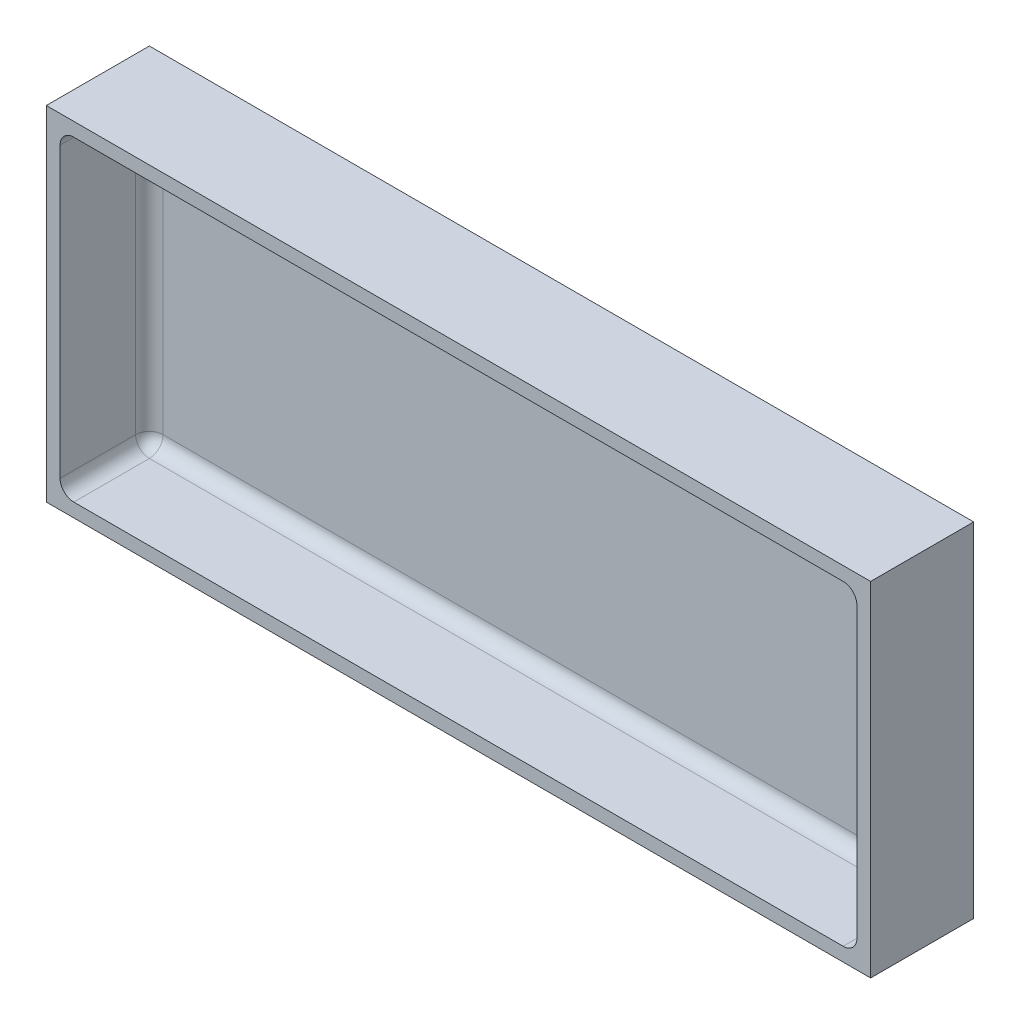
ISO-10303-21;
HEADER;
FILE_DESCRIPTION(('STEP AP214'),'2;1');
FILE_NAME('part.step','',(''),(''),'','','');
FILE_SCHEMA(('AUTOMOTIVE_DESIGN { 1 0 10303 214 1 1 1 1 }'));
ENDSEC;
DATA;
#1=APPLICATION_CONTEXT('core data for automotive mechanical design processes');
#2=APPLICATION_PROTOCOL_DEFINITION('international standard','automotive_design',2000,#1);
#3=PRODUCT_CONTEXT('',#1,'mechanical');
#4=PRODUCT('Part','Part','',(#3));
#5=PRODUCT_RELATED_PRODUCT_CATEGORY('part','',(#4));
#6=PRODUCT_DEFINITION_FORMATION('','',#4);
#7=PRODUCT_DEFINITION_CONTEXT('part definition',#1,'design');
#8=PRODUCT_DEFINITION('design','',#6,#7);
#9=PRODUCT_DEFINITION_SHAPE('','',#8);
#10=(LENGTH_UNIT() NAMED_UNIT(*) SI_UNIT(.MILLI.,.METRE.));
#11=(NAMED_UNIT(*) PLANE_ANGLE_UNIT() SI_UNIT($,.RADIAN.));
#12=(NAMED_UNIT(*) SI_UNIT($,.STERADIAN.) SOLID_ANGLE_UNIT());
#13=UNCERTAINTY_MEASURE_WITH_UNIT(LENGTH_MEASURE(1.E-05),#10,'distance_accuracy_value','');
#14=(GEOMETRIC_REPRESENTATION_CONTEXT(3) GLOBAL_UNCERTAINTY_ASSIGNED_CONTEXT((#13)) GLOBAL_UNIT_ASSIGNED_CONTEXT((#10,
#11,#12)) REPRESENTATION_CONTEXT('',''));
#15=CARTESIAN_POINT('',(0.,0.,0.));
#16=DIRECTION('',(0.,0.,1.));
#17=DIRECTION('',(1.,0.,0.));
#18=AXIS2_PLACEMENT_3D('',#15,#16,#17);
#19=CARTESIAN_POINT('',(0.,0.,0.));
#20=DIRECTION('',(0.,0.,-1.));
#21=DIRECTION('',(-1.,0.,0.));
#22=AXIS2_PLACEMENT_3D('',#19,#20,#21);
#23=PLANE('',#22);
#24=DIRECTION('',(0.,1.,0.));
#25=VECTOR('',#24,1.);
#26=CARTESIAN_POINT('',(60.,-25.,0.));
#27=LINE('',#26,#25);
#28=CARTESIAN_POINT('',(60.,-25.,0.));
#29=VERTEX_POINT('',#28);
#30=CARTESIAN_POINT('',(60.,25.,0.));
#31=VERTEX_POINT('',#30);
#32=EDGE_CURVE('E181',#29,#31,#27,.T.);
#33=ORIENTED_EDGE('',*,*,#32,.T.);
#34=DIRECTION('',(-1.,0.,0.));
#35=VECTOR('',#34,1.);
#36=CARTESIAN_POINT('',(-60.,25.,0.));
#37=LINE('',#36,#35);
#38=CARTESIAN_POINT('',(-60.,25.,0.));
#39=VERTEX_POINT('',#38);
#40=EDGE_CURVE('E150',#31,#39,#37,.T.);
#41=ORIENTED_EDGE('',*,*,#40,.T.);
#42=DIRECTION('',(0.,-1.,0.));
#43=VECTOR('',#42,1.);
#44=CARTESIAN_POINT('',(-60.,-25.,0.));
#45=LINE('',#44,#43);
#46=CARTESIAN_POINT('',(-60.,-25.,0.));
#47=VERTEX_POINT('',#46);
#48=EDGE_CURVE('E173',#39,#47,#45,.T.);
#49=ORIENTED_EDGE('',*,*,#48,.T.);
#50=DIRECTION('',(1.,0.,0.));
#51=VECTOR('',#50,1.);
#52=CARTESIAN_POINT('',(-60.,-25.,0.));
#53=LINE('',#52,#51);
#54=EDGE_CURVE('E170',#47,#29,#53,.T.);
#55=ORIENTED_EDGE('',*,*,#54,.T.);
#56=EDGE_LOOP('',(#33,#41,#49,#55));
#57=FACE_BOUND('',#56,.T.);
#58=DIRECTION('',(0.,1.,0.));
#59=VECTOR('',#58,1.);
#60=CARTESIAN_POINT('',(58.,-25.,0.));
#61=LINE('',#60,#59);
#62=CARTESIAN_POINT('',(58.,-21.,0.));
#63=VERTEX_POINT('',#62);
#64=CARTESIAN_POINT('',(58.,21.,0.));
#65=VERTEX_POINT('',#64);
#66=EDGE_CURVE('E260',#63,#65,#61,.T.);
#67=ORIENTED_EDGE('',*,*,#66,.F.);
#68=CARTESIAN_POINT('',(56.,-21.,0.));
#69=DIRECTION('',(0.,0.,-1.));
#70=DIRECTION('',(-1.,0.,0.));
#71=AXIS2_PLACEMENT_3D('',#68,#69,#70);
#72=CIRCLE('',#71,2.);
#73=CARTESIAN_POINT('',(56.,-23.,0.));
#74=VERTEX_POINT('',#73);
#75=EDGE_CURVE('E224',#63,#74,#72,.T.);
#76=ORIENTED_EDGE('',*,*,#75,.T.);
#77=DIRECTION('',(1.,0.,0.));
#78=VECTOR('',#77,1.);
#79=CARTESIAN_POINT('',(-60.,-23.,0.));
#80=LINE('',#79,#78);
#81=CARTESIAN_POINT('',(-56.,-23.,0.));
#82=VERTEX_POINT('',#81);
#83=EDGE_CURVE('E176',#82,#74,#80,.T.);
#84=ORIENTED_EDGE('',*,*,#83,.F.);
#85=CARTESIAN_POINT('',(-56.,-21.,0.));
#86=DIRECTION('',(0.,0.,-1.));
#87=DIRECTION('',(-1.,0.,0.));
#88=AXIS2_PLACEMENT_3D('',#85,#86,#87);
#89=CIRCLE('',#88,2.);
#90=CARTESIAN_POINT('',(-58.,-21.,0.));
#91=VERTEX_POINT('',#90);
#92=EDGE_CURVE('E52',#82,#91,#89,.T.);
#93=ORIENTED_EDGE('',*,*,#92,.T.);
#94=DIRECTION('',(0.,-1.,0.));
#95=VECTOR('',#94,1.);
#96=CARTESIAN_POINT('',(-58.,-25.,0.));
#97=LINE('',#96,#95);
#98=CARTESIAN_POINT('',(-58.,21.,0.));
#99=VERTEX_POINT('',#98);
#100=EDGE_CURVE('E266',#99,#91,#97,.T.);
#101=ORIENTED_EDGE('',*,*,#100,.F.);
#102=CARTESIAN_POINT('',(-56.,21.,0.));
#103=DIRECTION('',(0.,0.,-1.));
#104=DIRECTION('',(-1.,0.,0.));
#105=AXIS2_PLACEMENT_3D('',#102,#103,#104);
#106=CIRCLE('',#105,2.);
#107=CARTESIAN_POINT('',(-56.,23.,0.));
#108=VERTEX_POINT('',#107);
#109=EDGE_CURVE('E11',#99,#108,#106,.T.);
#110=ORIENTED_EDGE('',*,*,#109,.T.);
#111=DIRECTION('',(-1.,0.,0.));
#112=VECTOR('',#111,1.);
#113=CARTESIAN_POINT('',(-60.,23.,0.));
#114=LINE('',#113,#112);
#115=CARTESIAN_POINT('',(56.,23.,0.));
#116=VERTEX_POINT('',#115);
#117=EDGE_CURVE('E262',#116,#108,#114,.T.);
#118=ORIENTED_EDGE('',*,*,#117,.F.);
#119=CARTESIAN_POINT('',(56.,21.,0.));
#120=DIRECTION('',(0.,0.,-1.));
#121=DIRECTION('',(-1.,0.,0.));
#122=AXIS2_PLACEMENT_3D('',#119,#120,#121);
#123=CIRCLE('',#122,2.);
#124=EDGE_CURVE('E222',#116,#65,#123,.T.);
#125=ORIENTED_EDGE('',*,*,#124,.T.);
#126=EDGE_LOOP('',(#67,#76,#84,#93,#101,#110,#118,#125));
#127=FACE_BOUND('',#126,.T.);
#128=ADVANCED_FACE('F43',(#57,#127),#23,.F.);
#129=CARTESIAN_POINT('',(60.,-25.,-15.));
#130=DIRECTION('',(1.,0.,0.));
#131=DIRECTION('',(0.,0.,-1.));
#132=AXIS2_PLACEMENT_3D('',#129,#130,#131);
#133=PLANE('',#132);
#134=ORIENTED_EDGE('',*,*,#32,.F.);
#135=DIRECTION('',(0.,0.,1.));
#136=VECTOR('',#135,1.);
#137=CARTESIAN_POINT('',(60.,-25.,-15.));
#138=LINE('',#137,#136);
#139=CARTESIAN_POINT('',(60.,-25.,-15.));
#140=VERTEX_POINT('',#139);
#141=EDGE_CURVE('E169',#140,#29,#138,.T.);
#142=ORIENTED_EDGE('',*,*,#141,.F.);
#143=DIRECTION('',(0.,1.,0.));
#144=VECTOR('',#143,1.);
#145=CARTESIAN_POINT('',(60.,-25.,-15.));
#146=LINE('',#145,#144);
#147=CARTESIAN_POINT('',(60.,25.,-15.));
#148=VERTEX_POINT('',#147);
#149=EDGE_CURVE('E163',#140,#148,#146,.T.);
#150=ORIENTED_EDGE('',*,*,#149,.T.);
#151=DIRECTION('',(0.,0.,1.));
#152=VECTOR('',#151,1.);
#153=CARTESIAN_POINT('',(60.,25.,-15.));
#154=LINE('',#153,#152);
#155=EDGE_CURVE('E145',#148,#31,#154,.T.);
#156=ORIENTED_EDGE('',*,*,#155,.T.);
#157=EDGE_LOOP('',(#134,#142,#150,#156));
#158=FACE_BOUND('',#157,.T.);
#159=ADVANCED_FACE('F168',(#158),#133,.T.);
#160=CARTESIAN_POINT('',(-60.,-25.,-15.));
#161=DIRECTION('',(0.,-1.,0.));
#162=DIRECTION('',(0.,0.,-1.));
#163=AXIS2_PLACEMENT_3D('',#160,#161,#162);
#164=PLANE('',#163);
#165=ORIENTED_EDGE('',*,*,#54,.F.);
#166=DIRECTION('',(0.,0.,1.));
#167=VECTOR('',#166,1.);
#168=CARTESIAN_POINT('',(-60.,-25.,-15.));
#169=LINE('',#168,#167);
#170=CARTESIAN_POINT('',(-60.,-25.,-15.));
#171=VERTEX_POINT('',#170);
#172=EDGE_CURVE('E188',#171,#47,#169,.T.);
#173=ORIENTED_EDGE('',*,*,#172,.F.);
#174=DIRECTION('',(1.,0.,0.));
#175=VECTOR('',#174,1.);
#176=CARTESIAN_POINT('',(-60.,-25.,-15.));
#177=LINE('',#176,#175);
#178=EDGE_CURVE('E156',#171,#140,#177,.T.);
#179=ORIENTED_EDGE('',*,*,#178,.T.);
#180=ORIENTED_EDGE('',*,*,#141,.T.);
#181=EDGE_LOOP('',(#165,#173,#179,#180));
#182=FACE_BOUND('',#181,.T.);
#183=ADVANCED_FACE('F343',(#182),#164,.T.);
#184=CARTESIAN_POINT('',(-60.,-25.,-15.));
#185=DIRECTION('',(-1.,0.,0.));
#186=DIRECTION('',(0.,0.,1.));
#187=AXIS2_PLACEMENT_3D('',#184,#185,#186);
#188=PLANE('',#187);
#189=ORIENTED_EDGE('',*,*,#48,.F.);
#190=DIRECTION('',(0.,0.,1.));
#191=VECTOR('',#190,1.);
#192=CARTESIAN_POINT('',(-60.,25.,-15.));
#193=LINE('',#192,#191);
#194=CARTESIAN_POINT('',(-60.,25.,-15.));
#195=VERTEX_POINT('',#194);
#196=EDGE_CURVE('E155',#195,#39,#193,.T.);
#197=ORIENTED_EDGE('',*,*,#196,.F.);
#198=DIRECTION('',(0.,-1.,0.));
#199=VECTOR('',#198,1.);
#200=CARTESIAN_POINT('',(-60.,-25.,-15.));
#201=LINE('',#200,#199);
#202=EDGE_CURVE('E166',#195,#171,#201,.T.);
#203=ORIENTED_EDGE('',*,*,#202,.T.);
#204=ORIENTED_EDGE('',*,*,#172,.T.);
#205=EDGE_LOOP('',(#189,#197,#203,#204));
#206=FACE_BOUND('',#205,.T.);
#207=ADVANCED_FACE('F350',(#206),#188,.T.);
#208=CARTESIAN_POINT('',(-60.,25.,-15.));
#209=DIRECTION('',(0.,1.,0.));
#210=DIRECTION('',(0.,0.,1.));
#211=AXIS2_PLACEMENT_3D('',#208,#209,#210);
#212=PLANE('',#211);
#213=ORIENTED_EDGE('',*,*,#40,.F.);
#214=ORIENTED_EDGE('',*,*,#155,.F.);
#215=DIRECTION('',(-1.,0.,0.));
#216=VECTOR('',#215,1.);
#217=CARTESIAN_POINT('',(-60.,25.,-15.));
#218=LINE('',#217,#216);
#219=EDGE_CURVE('E148',#148,#195,#218,.T.);
#220=ORIENTED_EDGE('',*,*,#219,.T.);
#221=ORIENTED_EDGE('',*,*,#196,.T.);
#222=EDGE_LOOP('',(#213,#214,#220,#221));
#223=FACE_BOUND('',#222,.T.);
#224=ADVANCED_FACE('F147',(#223),#212,.T.);
#225=CARTESIAN_POINT('',(0.,0.,-15.));
#226=DIRECTION('',(0.,0.,-1.));
#227=DIRECTION('',(-1.,0.,0.));
#228=AXIS2_PLACEMENT_3D('',#225,#226,#227);
#229=PLANE('',#228);
#230=ORIENTED_EDGE('',*,*,#149,.F.);
#231=ORIENTED_EDGE('',*,*,#178,.F.);
#232=ORIENTED_EDGE('',*,*,#202,.F.);
#233=ORIENTED_EDGE('',*,*,#219,.F.);
#234=EDGE_LOOP('',(#230,#231,#232,#233));
#235=FACE_BOUND('',#234,.T.);
#236=ADVANCED_FACE('F161',(#235),#229,.T.);
#237=CARTESIAN_POINT('',(58.,-25.,-15.));
#238=DIRECTION('',(1.,0.,0.));
#239=DIRECTION('',(0.,0.,-1.));
#240=AXIS2_PLACEMENT_3D('',#237,#238,#239);
#241=PLANE('',#240);
#242=ORIENTED_EDGE('',*,*,#66,.T.);
#243=DIRECTION('',(0.,0.,1.));
#244=VECTOR('',#243,1.);
#245=CARTESIAN_POINT('',(58.,21.,-13.));
#246=LINE('',#245,#244);
#247=CARTESIAN_POINT('',(58.,21.,-11.));
#248=VERTEX_POINT('',#247);
#249=EDGE_CURVE('E60',#65,#248,#246,.F.);
#250=ORIENTED_EDGE('',*,*,#249,.T.);
#251=DIRECTION('',(0.,1.,0.));
#252=VECTOR('',#251,1.);
#253=CARTESIAN_POINT('',(58.,-23.,-11.));
#254=LINE('',#253,#252);
#255=CARTESIAN_POINT('',(58.,-21.,-11.));
#256=VERTEX_POINT('',#255);
#257=EDGE_CURVE('E65',#248,#256,#254,.F.);
#258=ORIENTED_EDGE('',*,*,#257,.T.);
#259=DIRECTION('',(0.,0.,1.));
#260=VECTOR('',#259,1.);
#261=CARTESIAN_POINT('',(58.,-21.,0.));
#262=LINE('',#261,#260);
#263=EDGE_CURVE('E218',#256,#63,#262,.T.);
#264=ORIENTED_EDGE('',*,*,#263,.T.);
#265=EDGE_LOOP('',(#242,#250,#258,#264));
#266=FACE_BOUND('',#265,.T.);
#267=ADVANCED_FACE('F467',(#266),#241,.F.);
#268=CARTESIAN_POINT('',(-60.,-23.,-15.));
#269=DIRECTION('',(0.,-1.,0.));
#270=DIRECTION('',(0.,0.,-1.));
#271=AXIS2_PLACEMENT_3D('',#268,#269,#270);
#272=PLANE('',#271);
#273=ORIENTED_EDGE('',*,*,#83,.T.);
#274=DIRECTION('',(0.,0.,1.));
#275=VECTOR('',#274,1.);
#276=CARTESIAN_POINT('',(56.,-23.,-13.));
#277=LINE('',#276,#275);
#278=CARTESIAN_POINT('',(56.,-23.,-11.));
#279=VERTEX_POINT('',#278);
#280=EDGE_CURVE('E204',#74,#279,#277,.F.);
#281=ORIENTED_EDGE('',*,*,#280,.T.);
#282=DIRECTION('',(1.,0.,0.));
#283=VECTOR('',#282,1.);
#284=CARTESIAN_POINT('',(-58.,-23.,-11.));
#285=LINE('',#284,#283);
#286=CARTESIAN_POINT('',(-56.,-23.,-11.));
#287=VERTEX_POINT('',#286);
#288=EDGE_CURVE('E201',#279,#287,#285,.F.);
#289=ORIENTED_EDGE('',*,*,#288,.T.);
#290=DIRECTION('',(0.,0.,1.));
#291=VECTOR('',#290,1.);
#292=CARTESIAN_POINT('',(-56.,-23.,0.));
#293=LINE('',#292,#291);
#294=EDGE_CURVE('E199',#287,#82,#293,.T.);
#295=ORIENTED_EDGE('',*,*,#294,.T.);
#296=EDGE_LOOP('',(#273,#281,#289,#295));
#297=FACE_BOUND('',#296,.T.);
#298=ADVANCED_FACE('F276',(#297),#272,.F.);
#299=CARTESIAN_POINT('',(-58.,-25.,-15.));
#300=DIRECTION('',(-1.,0.,0.));
#301=DIRECTION('',(0.,0.,1.));
#302=AXIS2_PLACEMENT_3D('',#299,#300,#301);
#303=PLANE('',#302);
#304=ORIENTED_EDGE('',*,*,#100,.T.);
#305=DIRECTION('',(0.,0.,1.));
#306=VECTOR('',#305,1.);
#307=CARTESIAN_POINT('',(-58.,-21.,-13.));
#308=LINE('',#307,#306);
#309=CARTESIAN_POINT('',(-58.,-21.,-11.));
#310=VERTEX_POINT('',#309);
#311=EDGE_CURVE('E210',#91,#310,#308,.F.);
#312=ORIENTED_EDGE('',*,*,#311,.T.);
#313=DIRECTION('',(0.,-1.,0.));
#314=VECTOR('',#313,1.);
#315=CARTESIAN_POINT('',(-58.,23.,-11.));
#316=LINE('',#315,#314);
#317=CARTESIAN_POINT('',(-58.,21.,-11.));
#318=VERTEX_POINT('',#317);
#319=EDGE_CURVE('E208',#310,#318,#316,.F.);
#320=ORIENTED_EDGE('',*,*,#319,.T.);
#321=DIRECTION('',(0.,0.,1.));
#322=VECTOR('',#321,1.);
#323=CARTESIAN_POINT('',(-58.,21.,0.));
#324=LINE('',#323,#322);
#325=EDGE_CURVE('E206',#318,#99,#324,.T.);
#326=ORIENTED_EDGE('',*,*,#325,.T.);
#327=EDGE_LOOP('',(#304,#312,#320,#326));
#328=FACE_BOUND('',#327,.T.);
#329=ADVANCED_FACE('F452',(#328),#303,.F.);
#330=CARTESIAN_POINT('',(-60.,23.,-15.));
#331=DIRECTION('',(0.,1.,0.));
#332=DIRECTION('',(0.,0.,1.));
#333=AXIS2_PLACEMENT_3D('',#330,#331,#332);
#334=PLANE('',#333);
#335=DIRECTION('',(-1.,0.,0.));
#336=VECTOR('',#335,1.);
#337=CARTESIAN_POINT('',(58.,23.,-11.));
#338=LINE('',#337,#336);
#339=CARTESIAN_POINT('',(-56.,23.,-11.));
#340=VERTEX_POINT('',#339);
#341=CARTESIAN_POINT('',(56.,23.,-11.));
#342=VERTEX_POINT('',#341);
#343=EDGE_CURVE('E214',#340,#342,#338,.F.);
#344=ORIENTED_EDGE('',*,*,#343,.T.);
#345=DIRECTION('',(0.,0.,1.));
#346=VECTOR('',#345,1.);
#347=CARTESIAN_POINT('',(56.,23.,0.));
#348=LINE('',#347,#346);
#349=EDGE_CURVE('E216',#342,#116,#348,.T.);
#350=ORIENTED_EDGE('',*,*,#349,.T.);
#351=ORIENTED_EDGE('',*,*,#117,.T.);
#352=DIRECTION('',(0.,0.,1.));
#353=VECTOR('',#352,1.);
#354=CARTESIAN_POINT('',(-56.,23.,-13.));
#355=LINE('',#354,#353);
#356=EDGE_CURVE('E212',#108,#340,#355,.F.);
#357=ORIENTED_EDGE('',*,*,#356,.T.);
#358=EDGE_LOOP('',(#344,#350,#351,#357));
#359=FACE_BOUND('',#358,.T.);
#360=ADVANCED_FACE('F317',(#359),#334,.F.);
#361=CARTESIAN_POINT('',(0.,0.,-13.));
#362=DIRECTION('',(0.,0.,-1.));
#363=DIRECTION('',(-1.,0.,0.));
#364=AXIS2_PLACEMENT_3D('',#361,#362,#363);
#365=PLANE('',#364);
#366=DIRECTION('',(0.,-1.,0.));
#367=VECTOR('',#366,1.);
#368=CARTESIAN_POINT('',(-56.,-23.,-13.));
#369=LINE('',#368,#367);
#370=CARTESIAN_POINT('',(-56.,21.,-13.));
#371=VERTEX_POINT('',#370);
#372=CARTESIAN_POINT('',(-56.,-21.,-13.));
#373=VERTEX_POINT('',#372);
#374=EDGE_CURVE('E194',#371,#373,#369,.T.);
#375=ORIENTED_EDGE('',*,*,#374,.T.);
#376=DIRECTION('',(1.,0.,0.));
#377=VECTOR('',#376,1.);
#378=CARTESIAN_POINT('',(58.,-21.,-13.));
#379=LINE('',#378,#377);
#380=CARTESIAN_POINT('',(56.,-21.,-13.));
#381=VERTEX_POINT('',#380);
#382=EDGE_CURVE('E196',#373,#381,#379,.T.);
#383=ORIENTED_EDGE('',*,*,#382,.T.);
#384=DIRECTION('',(0.,1.,0.));
#385=VECTOR('',#384,1.);
#386=CARTESIAN_POINT('',(56.,23.,-13.));
#387=LINE('',#386,#385);
#388=CARTESIAN_POINT('',(56.,21.,-13.));
#389=VERTEX_POINT('',#388);
#390=EDGE_CURVE('E187',#381,#389,#387,.T.);
#391=ORIENTED_EDGE('',*,*,#390,.T.);
#392=DIRECTION('',(-1.,0.,0.));
#393=VECTOR('',#392,1.);
#394=CARTESIAN_POINT('',(-58.,21.,-13.));
#395=LINE('',#394,#393);
#396=EDGE_CURVE('E192',#389,#371,#395,.T.);
#397=ORIENTED_EDGE('',*,*,#396,.T.);
#398=EDGE_LOOP('',(#375,#383,#391,#397));
#399=FACE_BOUND('',#398,.T.);
#400=ADVANCED_FACE('F299',(#399),#365,.F.);
#401=CARTESIAN_POINT('',(-56.,21.,-15.));
#402=DIRECTION('',(0.,0.,-1.));
#403=DIRECTION('',(-1.,0.,0.));
#404=AXIS2_PLACEMENT_3D('',#401,#402,#403);
#405=CYLINDRICAL_SURFACE('',#404,2.);
#406=ORIENTED_EDGE('',*,*,#109,.F.);
#407=ORIENTED_EDGE('',*,*,#325,.F.);
#408=CARTESIAN_POINT('',(-56.,21.,-11.));
#409=DIRECTION('',(0.,0.,1.));
#410=DIRECTION('',(1.,0.,0.));
#411=AXIS2_PLACEMENT_3D('',#408,#409,#410);
#412=CIRCLE('',#411,2.);
#413=EDGE_CURVE('E47',#340,#318,#412,.T.);
#414=ORIENTED_EDGE('',*,*,#413,.F.);
#415=ORIENTED_EDGE('',*,*,#356,.F.);
#416=EDGE_LOOP('',(#406,#407,#414,#415));
#417=FACE_BOUND('',#416,.T.);
#418=ADVANCED_FACE('F45',(#417),#405,.F.);
#419=CARTESIAN_POINT('',(0.,21.,-11.));
#420=DIRECTION('',(1.,0.,0.));
#421=DIRECTION('',(0.,0.,-1.));
#422=AXIS2_PLACEMENT_3D('',#419,#420,#421);
#423=CYLINDRICAL_SURFACE('',#422,2.);
#424=CARTESIAN_POINT('',(56.,21.,-11.));
#425=DIRECTION('',(-1.,0.,0.));
#426=DIRECTION('',(0.,0.,1.));
#427=AXIS2_PLACEMENT_3D('',#424,#425,#426);
#428=CIRCLE('',#427,2.);
#429=EDGE_CURVE('E252',#342,#389,#428,.T.);
#430=ORIENTED_EDGE('',*,*,#429,.F.);
#431=ORIENTED_EDGE('',*,*,#343,.F.);
#432=CARTESIAN_POINT('',(-56.,21.,-11.));
#433=DIRECTION('',(1.,0.,0.));
#434=DIRECTION('',(0.,0.,-1.));
#435=AXIS2_PLACEMENT_3D('',#432,#433,#434);
#436=CIRCLE('',#435,2.);
#437=EDGE_CURVE('E254',#371,#340,#436,.T.);
#438=ORIENTED_EDGE('',*,*,#437,.F.);
#439=ORIENTED_EDGE('',*,*,#396,.F.);
#440=EDGE_LOOP('',(#430,#431,#438,#439));
#441=FACE_BOUND('',#440,.T.);
#442=ADVANCED_FACE('F321',(#441),#423,.F.);
#443=CARTESIAN_POINT('',(56.,21.,-15.));
#444=DIRECTION('',(0.,0.,-1.));
#445=DIRECTION('',(-1.,0.,0.));
#446=AXIS2_PLACEMENT_3D('',#443,#444,#445);
#447=CYLINDRICAL_SURFACE('',#446,2.);
#448=ORIENTED_EDGE('',*,*,#124,.F.);
#449=ORIENTED_EDGE('',*,*,#349,.F.);
#450=CARTESIAN_POINT('',(56.,21.,-11.));
#451=DIRECTION('',(0.,0.,1.));
#452=DIRECTION('',(1.,0.,0.));
#453=AXIS2_PLACEMENT_3D('',#450,#451,#452);
#454=CIRCLE('',#453,2.);
#455=EDGE_CURVE('E249',#248,#342,#454,.T.);
#456=ORIENTED_EDGE('',*,*,#455,.F.);
#457=ORIENTED_EDGE('',*,*,#249,.F.);
#458=EDGE_LOOP('',(#448,#449,#456,#457));
#459=FACE_BOUND('',#458,.T.);
#460=ADVANCED_FACE('F326',(#459),#447,.F.);
#461=CARTESIAN_POINT('',(-56.,21.,-11.));
#462=DIRECTION('',(0.,1.,0.));
#463=DIRECTION('',(0.,0.,1.));
#464=AXIS2_PLACEMENT_3D('',#461,#462,#463);
#465=SPHERICAL_SURFACE('',#464,2.);
#466=ORIENTED_EDGE('',*,*,#437,.T.);
#467=ORIENTED_EDGE('',*,*,#413,.T.);
#468=CARTESIAN_POINT('',(-56.,21.,-11.));
#469=DIRECTION('',(0.,-1.,0.));
#470=DIRECTION('',(0.,0.,-1.));
#471=AXIS2_PLACEMENT_3D('',#468,#469,#470);
#472=CIRCLE('',#471,2.);
#473=EDGE_CURVE('E246',#371,#318,#472,.F.);
#474=ORIENTED_EDGE('',*,*,#473,.F.);
#475=EDGE_LOOP('',(#466,#467,#474));
#476=FACE_BOUND('',#475,.T.);
#477=ADVANCED_FACE('F328',(#476),#465,.F.);
#478=CARTESIAN_POINT('',(56.,21.,-11.));
#479=DIRECTION('',(0.,1.,0.));
#480=DIRECTION('',(0.,0.,1.));
#481=AXIS2_PLACEMENT_3D('',#478,#479,#480);
#482=SPHERICAL_SURFACE('',#481,2.);
#483=ORIENTED_EDGE('',*,*,#455,.T.);
#484=ORIENTED_EDGE('',*,*,#429,.T.);
#485=CARTESIAN_POINT('',(56.,21.,-11.));
#486=DIRECTION('',(0.,-1.,0.));
#487=DIRECTION('',(0.,0.,-1.));
#488=AXIS2_PLACEMENT_3D('',#485,#486,#487);
#489=CIRCLE('',#488,2.);
#490=EDGE_CURVE('E243',#248,#389,#489,.F.);
#491=ORIENTED_EDGE('',*,*,#490,.F.);
#492=EDGE_LOOP('',(#483,#484,#491));
#493=FACE_BOUND('',#492,.T.);
#494=ADVANCED_FACE('F323',(#493),#482,.F.);
#495=CARTESIAN_POINT('',(-56.,-21.,-15.));
#496=DIRECTION('',(0.,0.,-1.));
#497=DIRECTION('',(-1.,0.,0.));
#498=AXIS2_PLACEMENT_3D('',#495,#496,#497);
#499=CYLINDRICAL_SURFACE('',#498,2.);
#500=ORIENTED_EDGE('',*,*,#92,.F.);
#501=ORIENTED_EDGE('',*,*,#294,.F.);
#502=CARTESIAN_POINT('',(-56.,-21.,-11.));
#503=DIRECTION('',(0.,0.,1.));
#504=DIRECTION('',(1.,0.,0.));
#505=AXIS2_PLACEMENT_3D('',#502,#503,#504);
#506=CIRCLE('',#505,2.);
#507=EDGE_CURVE('E240',#310,#287,#506,.T.);
#508=ORIENTED_EDGE('',*,*,#507,.F.);
#509=ORIENTED_EDGE('',*,*,#311,.F.);
#510=EDGE_LOOP('',(#500,#501,#508,#509));
#511=FACE_BOUND('',#510,.T.);
#512=ADVANCED_FACE('F309',(#511),#499,.F.);
#513=CARTESIAN_POINT('',(-56.,0.,-11.));
#514=DIRECTION('',(0.,1.,0.));
#515=DIRECTION('',(0.,0.,1.));
#516=AXIS2_PLACEMENT_3D('',#513,#514,#515);
#517=CYLINDRICAL_SURFACE('',#516,2.);
#518=ORIENTED_EDGE('',*,*,#473,.T.);
#519=ORIENTED_EDGE('',*,*,#319,.F.);
#520=CARTESIAN_POINT('',(-56.,-21.,-11.));
#521=DIRECTION('',(0.,1.,0.));
#522=DIRECTION('',(0.,0.,1.));
#523=AXIS2_PLACEMENT_3D('',#520,#521,#522);
#524=CIRCLE('',#523,2.);
#525=EDGE_CURVE('E237',#373,#310,#524,.T.);
#526=ORIENTED_EDGE('',*,*,#525,.F.);
#527=ORIENTED_EDGE('',*,*,#374,.F.);
#528=EDGE_LOOP('',(#518,#519,#526,#527));
#529=FACE_BOUND('',#528,.T.);
#530=ADVANCED_FACE('F304',(#529),#517,.F.);
#531=CARTESIAN_POINT('',(56.,0.,-11.));
#532=DIRECTION('',(0.,-1.,0.));
#533=DIRECTION('',(0.,0.,-1.));
#534=AXIS2_PLACEMENT_3D('',#531,#532,#533);
#535=CYLINDRICAL_SURFACE('',#534,2.);
#536=ORIENTED_EDGE('',*,*,#490,.T.);
#537=ORIENTED_EDGE('',*,*,#390,.F.);
#538=CARTESIAN_POINT('',(56.,-21.,-11.));
#539=DIRECTION('',(0.,1.,0.));
#540=DIRECTION('',(0.,0.,1.));
#541=AXIS2_PLACEMENT_3D('',#538,#539,#540);
#542=CIRCLE('',#541,2.);
#543=EDGE_CURVE('E234',#256,#381,#542,.T.);
#544=ORIENTED_EDGE('',*,*,#543,.F.);
#545=ORIENTED_EDGE('',*,*,#257,.F.);
#546=EDGE_LOOP('',(#536,#537,#544,#545));
#547=FACE_BOUND('',#546,.T.);
#548=ADVANCED_FACE('F295',(#547),#535,.F.);
#549=CARTESIAN_POINT('',(56.,-21.,-15.));
#550=DIRECTION('',(0.,0.,-1.));
#551=DIRECTION('',(-1.,0.,0.));
#552=AXIS2_PLACEMENT_3D('',#549,#550,#551);
#553=CYLINDRICAL_SURFACE('',#552,2.);
#554=ORIENTED_EDGE('',*,*,#75,.F.);
#555=ORIENTED_EDGE('',*,*,#263,.F.);
#556=CARTESIAN_POINT('',(56.,-21.,-11.));
#557=DIRECTION('',(0.,0.,1.));
#558=DIRECTION('',(1.,0.,0.));
#559=AXIS2_PLACEMENT_3D('',#556,#557,#558);
#560=CIRCLE('',#559,2.);
#561=EDGE_CURVE('E231',#279,#256,#560,.T.);
#562=ORIENTED_EDGE('',*,*,#561,.F.);
#563=ORIENTED_EDGE('',*,*,#280,.F.);
#564=EDGE_LOOP('',(#554,#555,#562,#563));
#565=FACE_BOUND('',#564,.T.);
#566=ADVANCED_FACE('F283',(#565),#553,.F.);
#567=CARTESIAN_POINT('',(-56.,-21.,-11.));
#568=DIRECTION('',(-1.,0.,0.));
#569=DIRECTION('',(0.,0.,1.));
#570=AXIS2_PLACEMENT_3D('',#567,#568,#569);
#571=SPHERICAL_SURFACE('',#570,2.);
#572=ORIENTED_EDGE('',*,*,#525,.T.);
#573=ORIENTED_EDGE('',*,*,#507,.T.);
#574=CARTESIAN_POINT('',(-56.,-21.,-11.));
#575=DIRECTION('',(1.,0.,0.));
#576=DIRECTION('',(0.,0.,-1.));
#577=AXIS2_PLACEMENT_3D('',#574,#575,#576);
#578=CIRCLE('',#577,2.);
#579=EDGE_CURVE('E229',#373,#287,#578,.F.);
#580=ORIENTED_EDGE('',*,*,#579,.F.);
#581=EDGE_LOOP('',(#572,#573,#580));
#582=FACE_BOUND('',#581,.T.);
#583=ADVANCED_FACE('F307',(#582),#571,.F.);
#584=CARTESIAN_POINT('',(56.,-21.,-11.));
#585=DIRECTION('',(1.,0.,0.));
#586=DIRECTION('',(0.,0.,-1.));
#587=AXIS2_PLACEMENT_3D('',#584,#585,#586);
#588=SPHERICAL_SURFACE('',#587,2.);
#589=ORIENTED_EDGE('',*,*,#561,.T.);
#590=ORIENTED_EDGE('',*,*,#543,.T.);
#591=CARTESIAN_POINT('',(56.,-21.,-11.));
#592=DIRECTION('',(-1.,0.,0.));
#593=DIRECTION('',(0.,0.,1.));
#594=AXIS2_PLACEMENT_3D('',#591,#592,#593);
#595=CIRCLE('',#594,2.);
#596=EDGE_CURVE('E227',#279,#381,#595,.F.);
#597=ORIENTED_EDGE('',*,*,#596,.F.);
#598=EDGE_LOOP('',(#589,#590,#597));
#599=FACE_BOUND('',#598,.T.);
#600=ADVANCED_FACE('F292',(#599),#588,.F.);
#601=CARTESIAN_POINT('',(0.,-21.,-11.));
#602=DIRECTION('',(-1.,0.,0.));
#603=DIRECTION('',(0.,0.,1.));
#604=AXIS2_PLACEMENT_3D('',#601,#602,#603);
#605=CYLINDRICAL_SURFACE('',#604,2.);
#606=ORIENTED_EDGE('',*,*,#579,.T.);
#607=ORIENTED_EDGE('',*,*,#288,.F.);
#608=ORIENTED_EDGE('',*,*,#596,.T.);
#609=ORIENTED_EDGE('',*,*,#382,.F.);
#610=EDGE_LOOP('',(#606,#607,#608,#609));
#611=FACE_BOUND('',#610,.T.);
#612=ADVANCED_FACE('F289',(#611),#605,.F.);
#613=CLOSED_SHELL('',(#128,#159,#183,#207,#224,#236,#267,#298,#329,#360,#400,#418,#442,#460,
#477,#494,#512,#530,#548,#566,#583,#600,#612));
#614=MANIFOLD_SOLID_BREP('B2',#613);
#615=ADVANCED_BREP_SHAPE_REPRESENTATION('',(#18,#614),#14);
#616=SHAPE_DEFINITION_REPRESENTATION(#9,#615);
ENDSEC;
END-ISO-10303-21;
